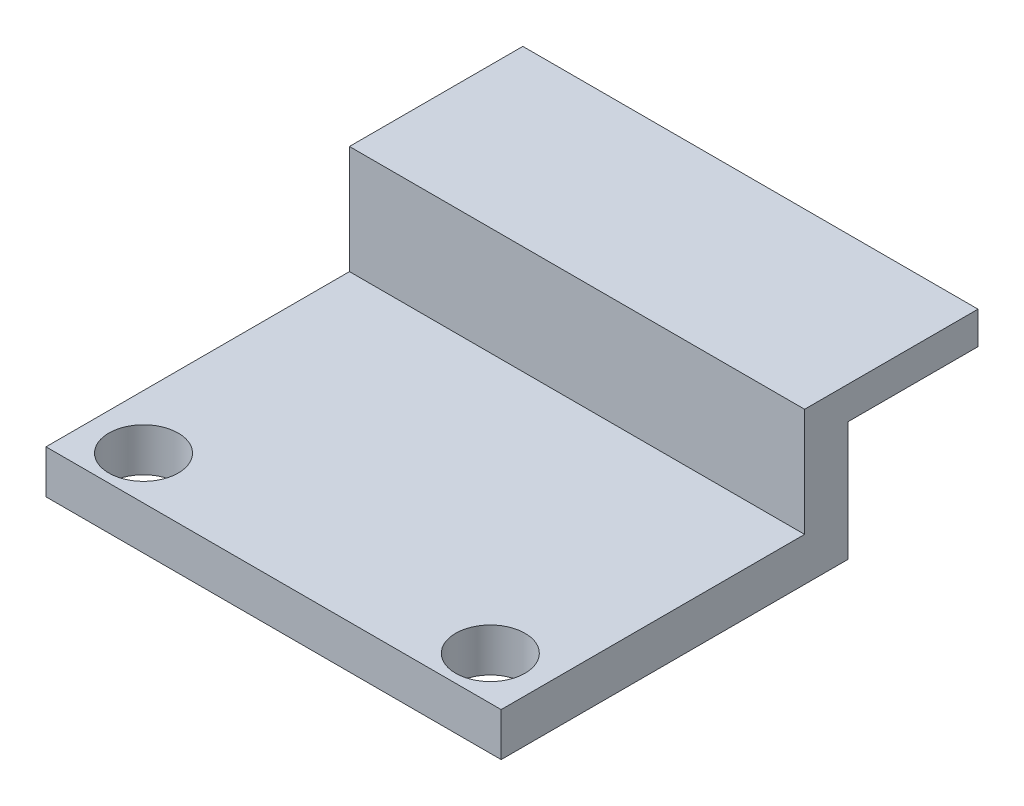
ISO-10303-21;
HEADER;
FILE_DESCRIPTION(('STEP AP214'),'2;1');
FILE_NAME('part.step','',(''),(''),'','','');
FILE_SCHEMA(('AUTOMOTIVE_DESIGN { 1 0 10303 214 1 1 1 1 }'));
ENDSEC;
DATA;
#1=APPLICATION_CONTEXT('core data for automotive mechanical design processes');
#2=APPLICATION_PROTOCOL_DEFINITION('international standard','automotive_design',2000,#1);
#3=PRODUCT_CONTEXT('',#1,'mechanical');
#4=PRODUCT('Part','Part','',(#3));
#5=PRODUCT_RELATED_PRODUCT_CATEGORY('part','',(#4));
#6=PRODUCT_DEFINITION_FORMATION('','',#4);
#7=PRODUCT_DEFINITION_CONTEXT('part definition',#1,'design');
#8=PRODUCT_DEFINITION('design','',#6,#7);
#9=PRODUCT_DEFINITION_SHAPE('','',#8);
#10=(LENGTH_UNIT() NAMED_UNIT(*) SI_UNIT(.MILLI.,.METRE.));
#11=(NAMED_UNIT(*) PLANE_ANGLE_UNIT() SI_UNIT($,.RADIAN.));
#12=(NAMED_UNIT(*) SI_UNIT($,.STERADIAN.) SOLID_ANGLE_UNIT());
#13=UNCERTAINTY_MEASURE_WITH_UNIT(LENGTH_MEASURE(1.E-05),#10,'distance_accuracy_value','');
#14=(GEOMETRIC_REPRESENTATION_CONTEXT(3) GLOBAL_UNCERTAINTY_ASSIGNED_CONTEXT((#13)) GLOBAL_UNIT_ASSIGNED_CONTEXT((#10,
#11,#12)) REPRESENTATION_CONTEXT('',''));
#15=CARTESIAN_POINT('',(0.,0.,0.));
#16=DIRECTION('',(0.,0.,1.));
#17=DIRECTION('',(1.,0.,0.));
#18=AXIS2_PLACEMENT_3D('',#15,#16,#17);
#19=CARTESIAN_POINT('',(0.,2.,0.));
#20=DIRECTION('',(0.,-1.,0.));
#21=DIRECTION('',(0.,0.,-1.));
#22=AXIS2_PLACEMENT_3D('',#19,#20,#21);
#23=PLANE('',#22);
#24=CARTESIAN_POINT('',(2.5,2.,-2.));
#25=DIRECTION('',(0.,1.,0.));
#26=DIRECTION('',(0.,0.,-1.));
#27=AXIS2_PLACEMENT_3D('',#24,#25,#26);
#28=CIRCLE('',#27,1.6);
#29=CARTESIAN_POINT('',(2.5,2.,-3.6));
#30=VERTEX_POINT('',#29);
#31=EDGE_CURVE('E162',#30,#30,#28,.T.);
#32=ORIENTED_EDGE('',*,*,#31,.F.);
#33=EDGE_LOOP('',(#32));
#34=FACE_BOUND('',#33,.T.);
#35=CARTESIAN_POINT('',(18.5,2.,-2.));
#36=DIRECTION('',(0.,1.,0.));
#37=DIRECTION('',(0.,0.,1.));
#38=AXIS2_PLACEMENT_3D('',#35,#36,#37);
#39=CIRCLE('',#38,1.6);
#40=CARTESIAN_POINT('',(18.5,2.,-0.399999999999998));
#41=VERTEX_POINT('',#40);
#42=EDGE_CURVE('E104',#41,#41,#39,.T.);
#43=ORIENTED_EDGE('',*,*,#42,.F.);
#44=EDGE_LOOP('',(#43));
#45=FACE_BOUND('',#44,.T.);
#46=DIRECTION('',(1.,0.,0.));
#47=VECTOR('',#46,1.);
#48=CARTESIAN_POINT('',(0.,2.,-14.));
#49=LINE('',#48,#47);
#50=CARTESIAN_POINT('',(0.,2.,-14.));
#51=VERTEX_POINT('',#50);
#52=CARTESIAN_POINT('',(21.,2.,-14.));
#53=VERTEX_POINT('',#52);
#54=EDGE_CURVE('E50',#51,#53,#49,.T.);
#55=ORIENTED_EDGE('',*,*,#54,.F.);
#56=DIRECTION('',(0.,0.,1.));
#57=VECTOR('',#56,1.);
#58=CARTESIAN_POINT('',(0.,2.,0.));
#59=LINE('',#58,#57);
#60=CARTESIAN_POINT('',(0.,2.,0.));
#61=VERTEX_POINT('',#60);
#62=EDGE_CURVE('E88',#51,#61,#59,.T.);
#63=ORIENTED_EDGE('',*,*,#62,.T.);
#64=DIRECTION('',(1.,0.,0.));
#65=VECTOR('',#64,1.);
#66=CARTESIAN_POINT('',(0.,2.,0.));
#67=LINE('',#66,#65);
#68=CARTESIAN_POINT('',(21.,2.,0.));
#69=VERTEX_POINT('',#68);
#70=EDGE_CURVE('E56',#61,#69,#67,.T.);
#71=ORIENTED_EDGE('',*,*,#70,.T.);
#72=DIRECTION('',(0.,0.,-1.));
#73=VECTOR('',#72,1.);
#74=CARTESIAN_POINT('',(21.,2.,0.));
#75=LINE('',#74,#73);
#76=EDGE_CURVE('E99',#69,#53,#75,.T.);
#77=ORIENTED_EDGE('',*,*,#76,.T.);
#78=EDGE_LOOP('',(#55,#63,#71,#77));
#79=FACE_BOUND('',#78,.T.);
#80=ADVANCED_FACE('F35',(#34,#45,#79),#23,.F.);
#81=CARTESIAN_POINT('',(0.,0.,0.));
#82=DIRECTION('',(0.,-1.,0.));
#83=DIRECTION('',(0.,0.,-1.));
#84=AXIS2_PLACEMENT_3D('',#81,#82,#83);
#85=PLANE('',#84);
#86=CARTESIAN_POINT('',(18.5,0.,-2.));
#87=DIRECTION('',(0.,1.,0.));
#88=DIRECTION('',(0.,0.,1.));
#89=AXIS2_PLACEMENT_3D('',#86,#87,#88);
#90=CIRCLE('',#89,1.6);
#91=CARTESIAN_POINT('',(18.5,0.,-0.399999999999998));
#92=VERTEX_POINT('',#91);
#93=EDGE_CURVE('E108',#92,#92,#90,.T.);
#94=ORIENTED_EDGE('',*,*,#93,.T.);
#95=EDGE_LOOP('',(#94));
#96=FACE_BOUND('',#95,.T.);
#97=DIRECTION('',(0.,0.,1.));
#98=VECTOR('',#97,1.);
#99=CARTESIAN_POINT('',(0.,0.,0.));
#100=LINE('',#99,#98);
#101=CARTESIAN_POINT('',(0.,0.,-16.));
#102=VERTEX_POINT('',#101);
#103=CARTESIAN_POINT('',(0.,0.,0.));
#104=VERTEX_POINT('',#103);
#105=EDGE_CURVE('E95',#102,#104,#100,.T.);
#106=ORIENTED_EDGE('',*,*,#105,.F.);
#107=DIRECTION('',(-1.,0.,0.));
#108=VECTOR('',#107,1.);
#109=CARTESIAN_POINT('',(0.,0.,-16.));
#110=LINE('',#109,#108);
#111=CARTESIAN_POINT('',(21.,0.,-16.));
#112=VERTEX_POINT('',#111);
#113=EDGE_CURVE('E76',#112,#102,#110,.T.);
#114=ORIENTED_EDGE('',*,*,#113,.F.);
#115=DIRECTION('',(0.,0.,-1.));
#116=VECTOR('',#115,1.);
#117=CARTESIAN_POINT('',(21.,0.,0.));
#118=LINE('',#117,#116);
#119=CARTESIAN_POINT('',(21.,0.,0.));
#120=VERTEX_POINT('',#119);
#121=EDGE_CURVE('E89',#120,#112,#118,.T.);
#122=ORIENTED_EDGE('',*,*,#121,.F.);
#123=DIRECTION('',(1.,0.,0.));
#124=VECTOR('',#123,1.);
#125=CARTESIAN_POINT('',(0.,0.,0.));
#126=LINE('',#125,#124);
#127=EDGE_CURVE('E103',#104,#120,#126,.T.);
#128=ORIENTED_EDGE('',*,*,#127,.F.);
#129=EDGE_LOOP('',(#106,#114,#122,#128));
#130=FACE_BOUND('',#129,.T.);
#131=CARTESIAN_POINT('',(2.5,0.,-2.));
#132=DIRECTION('',(0.,1.,0.));
#133=DIRECTION('',(0.,0.,-1.));
#134=AXIS2_PLACEMENT_3D('',#131,#132,#133);
#135=CIRCLE('',#134,1.6);
#136=CARTESIAN_POINT('',(2.5,0.,-3.6));
#137=VERTEX_POINT('',#136);
#138=EDGE_CURVE('E155',#137,#137,#135,.T.);
#139=ORIENTED_EDGE('',*,*,#138,.T.);
#140=EDGE_LOOP('',(#139));
#141=FACE_BOUND('',#140,.T.);
#142=ADVANCED_FACE('F101',(#96,#130,#141),#85,.T.);
#143=CARTESIAN_POINT('',(0.,2.,0.));
#144=DIRECTION('',(1.,0.,0.));
#145=DIRECTION('',(0.,0.,-1.));
#146=AXIS2_PLACEMENT_3D('',#143,#144,#145);
#147=PLANE('',#146);
#148=ORIENTED_EDGE('',*,*,#105,.T.);
#149=DIRECTION('',(0.,-1.,0.));
#150=VECTOR('',#149,1.);
#151=CARTESIAN_POINT('',(0.,2.,0.));
#152=LINE('',#151,#150);
#153=EDGE_CURVE('E11',#61,#104,#152,.T.);
#154=ORIENTED_EDGE('',*,*,#153,.F.);
#155=ORIENTED_EDGE('',*,*,#62,.F.);
#156=DIRECTION('',(0.,-1.,0.));
#157=VECTOR('',#156,1.);
#158=CARTESIAN_POINT('',(0.,2.,-14.));
#159=LINE('',#158,#157);
#160=CARTESIAN_POINT('',(0.,7.,-14.));
#161=VERTEX_POINT('',#160);
#162=EDGE_CURVE('E124',#161,#51,#159,.T.);
#163=ORIENTED_EDGE('',*,*,#162,.F.);
#164=DIRECTION('',(0.,0.,1.));
#165=VECTOR('',#164,1.);
#166=CARTESIAN_POINT('',(0.,7.,-14.));
#167=LINE('',#166,#165);
#168=CARTESIAN_POINT('',(0.,7.,-22.));
#169=VERTEX_POINT('',#168);
#170=EDGE_CURVE('E135',#169,#161,#167,.T.);
#171=ORIENTED_EDGE('',*,*,#170,.F.);
#172=DIRECTION('',(0.,1.,0.));
#173=VECTOR('',#172,1.);
#174=CARTESIAN_POINT('',(0.,7.,-22.));
#175=LINE('',#174,#173);
#176=CARTESIAN_POINT('',(0.,5.5,-22.));
#177=VERTEX_POINT('',#176);
#178=EDGE_CURVE('E139',#177,#169,#175,.T.);
#179=ORIENTED_EDGE('',*,*,#178,.F.);
#180=DIRECTION('',(0.,0.,-1.));
#181=VECTOR('',#180,1.);
#182=CARTESIAN_POINT('',(0.,5.5,-22.));
#183=LINE('',#182,#181);
#184=CARTESIAN_POINT('',(0.,5.5,-16.));
#185=VERTEX_POINT('',#184);
#186=EDGE_CURVE('E98',#185,#177,#183,.T.);
#187=ORIENTED_EDGE('',*,*,#186,.F.);
#188=DIRECTION('',(0.,-1.,0.));
#189=VECTOR('',#188,1.);
#190=CARTESIAN_POINT('',(0.,2.,-16.));
#191=LINE('',#190,#189);
#192=EDGE_CURVE('E81',#185,#102,#191,.T.);
#193=ORIENTED_EDGE('',*,*,#192,.T.);
#194=EDGE_LOOP('',(#148,#154,#155,#163,#171,#179,#187,#193));
#195=FACE_BOUND('',#194,.T.);
#196=ADVANCED_FACE('F37',(#195),#147,.F.);
#197=CARTESIAN_POINT('',(0.,2.,0.));
#198=DIRECTION('',(0.,0.,-1.));
#199=DIRECTION('',(-1.,0.,0.));
#200=AXIS2_PLACEMENT_3D('',#197,#198,#199);
#201=PLANE('',#200);
#202=ORIENTED_EDGE('',*,*,#127,.T.);
#203=DIRECTION('',(0.,-1.,0.));
#204=VECTOR('',#203,1.);
#205=CARTESIAN_POINT('',(21.,2.,0.));
#206=LINE('',#205,#204);
#207=EDGE_CURVE('E43',#69,#120,#206,.T.);
#208=ORIENTED_EDGE('',*,*,#207,.F.);
#209=ORIENTED_EDGE('',*,*,#70,.F.);
#210=ORIENTED_EDGE('',*,*,#153,.T.);
#211=EDGE_LOOP('',(#202,#208,#209,#210));
#212=FACE_BOUND('',#211,.T.);
#213=ADVANCED_FACE('F120',(#212),#201,.F.);
#214=CARTESIAN_POINT('',(21.,2.,0.));
#215=DIRECTION('',(-1.,0.,0.));
#216=DIRECTION('',(0.,0.,1.));
#217=AXIS2_PLACEMENT_3D('',#214,#215,#216);
#218=PLANE('',#217);
#219=ORIENTED_EDGE('',*,*,#121,.T.);
#220=DIRECTION('',(0.,-1.,0.));
#221=VECTOR('',#220,1.);
#222=CARTESIAN_POINT('',(21.,2.,-16.));
#223=LINE('',#222,#221);
#224=CARTESIAN_POINT('',(21.,5.5,-16.));
#225=VERTEX_POINT('',#224);
#226=EDGE_CURVE('E84',#225,#112,#223,.T.);
#227=ORIENTED_EDGE('',*,*,#226,.F.);
#228=DIRECTION('',(0.,0.,-1.));
#229=VECTOR('',#228,1.);
#230=CARTESIAN_POINT('',(21.,5.5,-22.));
#231=LINE('',#230,#229);
#232=CARTESIAN_POINT('',(21.,5.5,-22.));
#233=VERTEX_POINT('',#232);
#234=EDGE_CURVE('E143',#225,#233,#231,.T.);
#235=ORIENTED_EDGE('',*,*,#234,.T.);
#236=DIRECTION('',(0.,1.,0.));
#237=VECTOR('',#236,1.);
#238=CARTESIAN_POINT('',(21.,7.,-22.));
#239=LINE('',#238,#237);
#240=CARTESIAN_POINT('',(21.,7.,-22.));
#241=VERTEX_POINT('',#240);
#242=EDGE_CURVE('E146',#233,#241,#239,.T.);
#243=ORIENTED_EDGE('',*,*,#242,.T.);
#244=DIRECTION('',(0.,0.,1.));
#245=VECTOR('',#244,1.);
#246=CARTESIAN_POINT('',(21.,7.,-14.));
#247=LINE('',#246,#245);
#248=CARTESIAN_POINT('',(21.,7.,-14.));
#249=VERTEX_POINT('',#248);
#250=EDGE_CURVE('E149',#241,#249,#247,.T.);
#251=ORIENTED_EDGE('',*,*,#250,.T.);
#252=DIRECTION('',(0.,-1.,0.));
#253=VECTOR('',#252,1.);
#254=CARTESIAN_POINT('',(21.,2.,-14.));
#255=LINE('',#254,#253);
#256=EDGE_CURVE('E152',#249,#53,#255,.T.);
#257=ORIENTED_EDGE('',*,*,#256,.T.);
#258=ORIENTED_EDGE('',*,*,#76,.F.);
#259=ORIENTED_EDGE('',*,*,#207,.T.);
#260=EDGE_LOOP('',(#219,#227,#235,#243,#251,#257,#258,#259));
#261=FACE_BOUND('',#260,.T.);
#262=ADVANCED_FACE('F117',(#261),#218,.F.);
#263=CARTESIAN_POINT('',(0.,2.,-16.));
#264=DIRECTION('',(0.,0.,1.));
#265=DIRECTION('',(1.,0.,0.));
#266=AXIS2_PLACEMENT_3D('',#263,#264,#265);
#267=PLANE('',#266);
#268=ORIENTED_EDGE('',*,*,#113,.T.);
#269=ORIENTED_EDGE('',*,*,#192,.F.);
#270=DIRECTION('',(1.,0.,0.));
#271=VECTOR('',#270,1.);
#272=CARTESIAN_POINT('',(0.,5.5,-16.));
#273=LINE('',#272,#271);
#274=EDGE_CURVE('E134',#185,#225,#273,.T.);
#275=ORIENTED_EDGE('',*,*,#274,.T.);
#276=ORIENTED_EDGE('',*,*,#226,.T.);
#277=EDGE_LOOP('',(#268,#269,#275,#276));
#278=FACE_BOUND('',#277,.T.);
#279=ADVANCED_FACE('F78',(#278),#267,.F.);
#280=CARTESIAN_POINT('',(18.5,2.,-2.));
#281=DIRECTION('',(0.,-1.,0.));
#282=DIRECTION('',(0.,0.,-1.));
#283=AXIS2_PLACEMENT_3D('',#280,#281,#282);
#284=CYLINDRICAL_SURFACE('',#283,1.6);
#285=ORIENTED_EDGE('',*,*,#42,.T.);
#286=EDGE_LOOP('',(#285));
#287=FACE_BOUND('',#286,.T.);
#288=ORIENTED_EDGE('',*,*,#93,.F.);
#289=EDGE_LOOP('',(#288));
#290=FACE_BOUND('',#289,.T.);
#291=ADVANCED_FACE('F215',(#287,#290),#284,.F.);
#292=CARTESIAN_POINT('',(2.5,2.,-2.));
#293=DIRECTION('',(0.,-1.,0.));
#294=DIRECTION('',(0.,0.,-1.));
#295=AXIS2_PLACEMENT_3D('',#292,#293,#294);
#296=CYLINDRICAL_SURFACE('',#295,1.6);
#297=ORIENTED_EDGE('',*,*,#31,.T.);
#298=EDGE_LOOP('',(#297));
#299=FACE_BOUND('',#298,.T.);
#300=ORIENTED_EDGE('',*,*,#138,.F.);
#301=EDGE_LOOP('',(#300));
#302=FACE_BOUND('',#301,.T.);
#303=ADVANCED_FACE('F202',(#299,#302),#296,.F.);
#304=CARTESIAN_POINT('',(0.,2.,-14.));
#305=DIRECTION('',(0.,0.,1.));
#306=DIRECTION('',(1.,0.,0.));
#307=AXIS2_PLACEMENT_3D('',#304,#305,#306);
#308=PLANE('',#307);
#309=ORIENTED_EDGE('',*,*,#256,.F.);
#310=DIRECTION('',(1.,0.,0.));
#311=VECTOR('',#310,1.);
#312=CARTESIAN_POINT('',(0.,7.,-14.));
#313=LINE('',#312,#311);
#314=EDGE_CURVE('E133',#161,#249,#313,.T.);
#315=ORIENTED_EDGE('',*,*,#314,.F.);
#316=ORIENTED_EDGE('',*,*,#162,.T.);
#317=ORIENTED_EDGE('',*,*,#54,.T.);
#318=EDGE_LOOP('',(#309,#315,#316,#317));
#319=FACE_BOUND('',#318,.T.);
#320=ADVANCED_FACE('F130',(#319),#308,.T.);
#321=CARTESIAN_POINT('',(0.,7.,-14.));
#322=DIRECTION('',(0.,1.,0.));
#323=DIRECTION('',(0.,0.,1.));
#324=AXIS2_PLACEMENT_3D('',#321,#322,#323);
#325=PLANE('',#324);
#326=ORIENTED_EDGE('',*,*,#250,.F.);
#327=DIRECTION('',(1.,0.,0.));
#328=VECTOR('',#327,1.);
#329=CARTESIAN_POINT('',(0.,7.,-22.));
#330=LINE('',#329,#328);
#331=EDGE_CURVE('E157',#169,#241,#330,.T.);
#332=ORIENTED_EDGE('',*,*,#331,.F.);
#333=ORIENTED_EDGE('',*,*,#170,.T.);
#334=ORIENTED_EDGE('',*,*,#314,.T.);
#335=EDGE_LOOP('',(#326,#332,#333,#334));
#336=FACE_BOUND('',#335,.T.);
#337=ADVANCED_FACE('F194',(#336),#325,.T.);
#338=CARTESIAN_POINT('',(0.,7.,-22.));
#339=DIRECTION('',(0.,0.,-1.));
#340=DIRECTION('',(-1.,0.,0.));
#341=AXIS2_PLACEMENT_3D('',#338,#339,#340);
#342=PLANE('',#341);
#343=ORIENTED_EDGE('',*,*,#242,.F.);
#344=DIRECTION('',(1.,0.,0.));
#345=VECTOR('',#344,1.);
#346=CARTESIAN_POINT('',(0.,5.5,-22.));
#347=LINE('',#346,#345);
#348=EDGE_CURVE('E137',#177,#233,#347,.T.);
#349=ORIENTED_EDGE('',*,*,#348,.F.);
#350=ORIENTED_EDGE('',*,*,#178,.T.);
#351=ORIENTED_EDGE('',*,*,#331,.T.);
#352=EDGE_LOOP('',(#343,#349,#350,#351));
#353=FACE_BOUND('',#352,.T.);
#354=ADVANCED_FACE('F187',(#353),#342,.T.);
#355=CARTESIAN_POINT('',(0.,5.5,-22.));
#356=DIRECTION('',(0.,-1.,0.));
#357=DIRECTION('',(0.,0.,-1.));
#358=AXIS2_PLACEMENT_3D('',#355,#356,#357);
#359=PLANE('',#358);
#360=ORIENTED_EDGE('',*,*,#234,.F.);
#361=ORIENTED_EDGE('',*,*,#274,.F.);
#362=ORIENTED_EDGE('',*,*,#186,.T.);
#363=ORIENTED_EDGE('',*,*,#348,.T.);
#364=EDGE_LOOP('',(#360,#361,#362,#363));
#365=FACE_BOUND('',#364,.T.);
#366=ADVANCED_FACE('F190',(#365),#359,.T.);
#367=CLOSED_SHELL('',(#80,#142,#196,#213,#262,#279,#291,#303,#320,#337,#354,#366));
#368=MANIFOLD_SOLID_BREP('B2',#367);
#369=ADVANCED_BREP_SHAPE_REPRESENTATION('',(#18,#368),#14);
#370=SHAPE_DEFINITION_REPRESENTATION(#9,#369);
ENDSEC;
END-ISO-10303-21;
